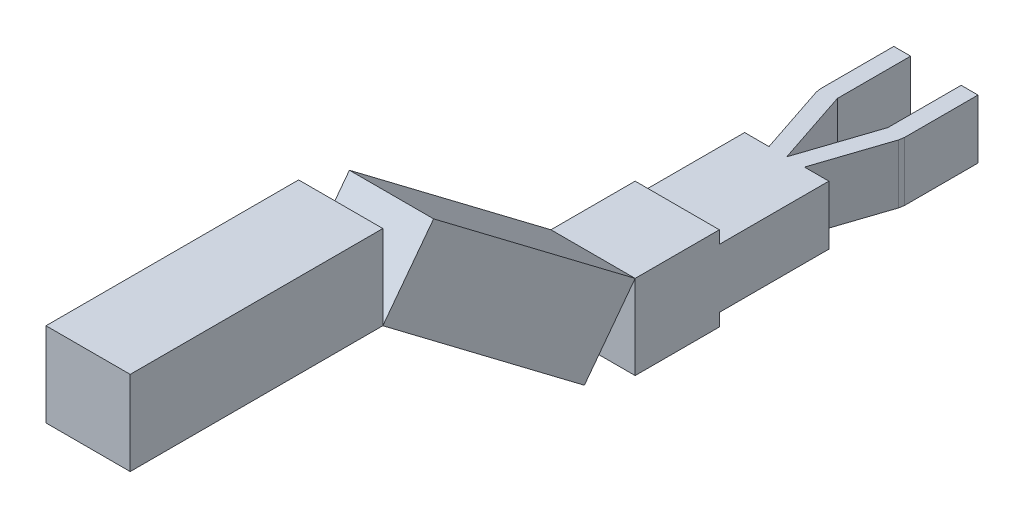
ISO-10303-21;
HEADER;
FILE_DESCRIPTION(('STEP AP214'),'2;1');
FILE_NAME('part.step','',(''),(''),'','','');
FILE_SCHEMA(('AUTOMOTIVE_DESIGN { 1 0 10303 214 1 1 1 1 }'));
ENDSEC;
DATA;
#1=APPLICATION_CONTEXT('core data for automotive mechanical design processes');
#2=APPLICATION_PROTOCOL_DEFINITION('international standard','automotive_design',2000,#1);
#3=PRODUCT_CONTEXT('',#1,'mechanical');
#4=PRODUCT('Part','Part','',(#3));
#5=PRODUCT_RELATED_PRODUCT_CATEGORY('part','',(#4));
#6=PRODUCT_DEFINITION_FORMATION('','',#4);
#7=PRODUCT_DEFINITION_CONTEXT('part definition',#1,'design');
#8=PRODUCT_DEFINITION('design','',#6,#7);
#9=PRODUCT_DEFINITION_SHAPE('','',#8);
#10=(LENGTH_UNIT() NAMED_UNIT(*) SI_UNIT(.MILLI.,.METRE.));
#11=(NAMED_UNIT(*) PLANE_ANGLE_UNIT() SI_UNIT($,.RADIAN.));
#12=(NAMED_UNIT(*) SI_UNIT($,.STERADIAN.) SOLID_ANGLE_UNIT());
#13=UNCERTAINTY_MEASURE_WITH_UNIT(LENGTH_MEASURE(1.E-05),#10,'distance_accuracy_value','');
#14=(GEOMETRIC_REPRESENTATION_CONTEXT(3) GLOBAL_UNCERTAINTY_ASSIGNED_CONTEXT((#13)) GLOBAL_UNIT_ASSIGNED_CONTEXT((#10,
#11,#12)) REPRESENTATION_CONTEXT('',''));
#15=CARTESIAN_POINT('',(0.,0.,0.));
#16=DIRECTION('',(0.,0.,1.));
#17=DIRECTION('',(1.,0.,0.));
#18=AXIS2_PLACEMENT_3D('',#15,#16,#17);
#19=CARTESIAN_POINT('',(50.0000000000001,186.100667301287,635.399647205051));
#20=DIRECTION('',(0.,0.,-1.));
#21=DIRECTION('',(-1.,0.,0.));
#22=AXIS2_PLACEMENT_3D('',#19,#20,#21);
#23=PLANE('',#22);
#24=DIRECTION('',(0.,-1.,0.));
#25=VECTOR('',#24,1.);
#26=CARTESIAN_POINT('',(-50.,186.100667301287,635.399647205051));
#27=LINE('',#26,#25);
#28=CARTESIAN_POINT('',(-50.,286.100667301287,635.399647205051));
#29=VERTEX_POINT('',#28);
#30=CARTESIAN_POINT('',(-50.,186.100667301287,635.399647205051));
#31=VERTEX_POINT('',#30);
#32=EDGE_CURVE('E108',#29,#31,#27,.T.);
#33=ORIENTED_EDGE('',*,*,#32,.F.);
#34=DIRECTION('',(-1.,0.,0.));
#35=VECTOR('',#34,1.);
#36=CARTESIAN_POINT('',(50.0000000000001,286.100667301287,635.399647205051));
#37=LINE('',#36,#35);
#38=CARTESIAN_POINT('',(50.0000000000001,286.100667301287,635.399647205051));
#39=VERTEX_POINT('',#38);
#40=EDGE_CURVE('E12',#39,#29,#37,.T.);
#41=ORIENTED_EDGE('',*,*,#40,.F.);
#42=DIRECTION('',(0.,-1.,0.));
#43=VECTOR('',#42,1.);
#44=CARTESIAN_POINT('',(50.0000000000001,186.100667301287,635.399647205051));
#45=LINE('',#44,#43);
#46=CARTESIAN_POINT('',(50.0000000000001,186.100667301287,635.399647205051));
#47=VERTEX_POINT('',#46);
#48=EDGE_CURVE('E102',#39,#47,#45,.T.);
#49=ORIENTED_EDGE('',*,*,#48,.T.);
#50=DIRECTION('',(-1.,0.,0.));
#51=VECTOR('',#50,1.);
#52=CARTESIAN_POINT('',(50.0000000000001,186.100667301287,635.399647205051));
#53=LINE('',#52,#51);
#54=EDGE_CURVE('E47',#47,#31,#53,.T.);
#55=ORIENTED_EDGE('',*,*,#54,.T.);
#56=EDGE_LOOP('',(#33,#41,#49,#55));
#57=FACE_BOUND('',#56,.T.);
#58=ADVANCED_FACE('F44',(#57),#23,.T.);
#59=CARTESIAN_POINT('',(50.0000000000001,286.100667301287,635.399647205051));
#60=DIRECTION('',(0.,1.,0.));
#61=DIRECTION('',(-1.,0.,0.));
#62=AXIS2_PLACEMENT_3D('',#59,#60,#61);
#63=PLANE('',#62);
#64=DIRECTION('',(0.,0.,-1.));
#65=VECTOR('',#64,1.);
#66=CARTESIAN_POINT('',(-50.,286.100667301287,635.399647205051));
#67=LINE('',#66,#65);
#68=CARTESIAN_POINT('',(-49.9999999999999,286.100667301287,935.399647205051));
#69=VERTEX_POINT('',#68);
#70=EDGE_CURVE('E104',#69,#29,#67,.T.);
#71=ORIENTED_EDGE('',*,*,#70,.F.);
#72=DIRECTION('',(-1.,0.,0.));
#73=VECTOR('',#72,1.);
#74=CARTESIAN_POINT('',(50.0000000000001,286.100667301287,935.399647205051));
#75=LINE('',#74,#73);
#76=CARTESIAN_POINT('',(50.0000000000001,286.100667301287,935.399647205051));
#77=VERTEX_POINT('',#76);
#78=EDGE_CURVE('E53',#77,#69,#75,.T.);
#79=ORIENTED_EDGE('',*,*,#78,.F.);
#80=DIRECTION('',(0.,0.,-1.));
#81=VECTOR('',#80,1.);
#82=CARTESIAN_POINT('',(50.0000000000001,286.100667301287,635.399647205051));
#83=LINE('',#82,#81);
#84=EDGE_CURVE('E99',#77,#39,#83,.T.);
#85=ORIENTED_EDGE('',*,*,#84,.T.);
#86=ORIENTED_EDGE('',*,*,#40,.T.);
#87=EDGE_LOOP('',(#71,#79,#85,#86));
#88=FACE_BOUND('',#87,.T.);
#89=ADVANCED_FACE('F118',(#88),#63,.T.);
#90=CARTESIAN_POINT('',(50.0000000000001,186.100667301287,935.399647205051));
#91=DIRECTION('',(0.,0.,1.));
#92=DIRECTION('',(1.,0.,0.));
#93=AXIS2_PLACEMENT_3D('',#90,#91,#92);
#94=PLANE('',#93);
#95=DIRECTION('',(0.,1.,0.));
#96=VECTOR('',#95,1.);
#97=CARTESIAN_POINT('',(-49.9999999999999,186.100667301287,935.399647205051));
#98=LINE('',#97,#96);
#99=CARTESIAN_POINT('',(-49.9999999999999,186.100667301287,935.399647205051));
#100=VERTEX_POINT('',#99);
#101=EDGE_CURVE('E94',#100,#69,#98,.T.);
#102=ORIENTED_EDGE('',*,*,#101,.F.);
#103=DIRECTION('',(-1.,0.,0.));
#104=VECTOR('',#103,1.);
#105=CARTESIAN_POINT('',(50.0000000000001,186.100667301287,935.399647205051));
#106=LINE('',#105,#104);
#107=CARTESIAN_POINT('',(50.0000000000001,186.100667301287,935.399647205051));
#108=VERTEX_POINT('',#107);
#109=EDGE_CURVE('E89',#108,#100,#106,.T.);
#110=ORIENTED_EDGE('',*,*,#109,.F.);
#111=DIRECTION('',(0.,1.,0.));
#112=VECTOR('',#111,1.);
#113=CARTESIAN_POINT('',(50.0000000000001,186.100667301287,935.399647205051));
#114=LINE('',#113,#112);
#115=EDGE_CURVE('E92',#108,#77,#114,.T.);
#116=ORIENTED_EDGE('',*,*,#115,.T.);
#117=ORIENTED_EDGE('',*,*,#78,.T.);
#118=EDGE_LOOP('',(#102,#110,#116,#117));
#119=FACE_BOUND('',#118,.T.);
#120=ADVANCED_FACE('F91',(#119),#94,.T.);
#121=CARTESIAN_POINT('',(50.0000000000001,186.100667301287,635.399647205051));
#122=DIRECTION('',(0.,-1.,0.));
#123=DIRECTION('',(1.,0.,0.));
#124=AXIS2_PLACEMENT_3D('',#121,#122,#123);
#125=PLANE('',#124);
#126=DIRECTION('',(0.,0.,1.));
#127=VECTOR('',#126,1.);
#128=CARTESIAN_POINT('',(-50.,186.100667301287,635.399647205051));
#129=LINE('',#128,#127);
#130=EDGE_CURVE('E111',#31,#100,#129,.T.);
#131=ORIENTED_EDGE('',*,*,#130,.F.);
#132=ORIENTED_EDGE('',*,*,#54,.F.);
#133=DIRECTION('',(0.,0.,1.));
#134=VECTOR('',#133,1.);
#135=CARTESIAN_POINT('',(50.0000000000001,186.100667301287,635.399647205051));
#136=LINE('',#135,#134);
#137=EDGE_CURVE('E98',#47,#108,#136,.T.);
#138=ORIENTED_EDGE('',*,*,#137,.T.);
#139=ORIENTED_EDGE('',*,*,#109,.T.);
#140=EDGE_LOOP('',(#131,#132,#138,#139));
#141=FACE_BOUND('',#140,.T.);
#142=ADVANCED_FACE('F101',(#141),#125,.T.);
#143=CARTESIAN_POINT('',(50.,0.,0.));
#144=DIRECTION('',(1.,0.,0.));
#145=DIRECTION('',(0.,0.,-1.));
#146=AXIS2_PLACEMENT_3D('',#143,#144,#145);
#147=PLANE('',#146);
#148=ORIENTED_EDGE('',*,*,#48,.F.);
#149=ORIENTED_EDGE('',*,*,#84,.F.);
#150=ORIENTED_EDGE('',*,*,#115,.F.);
#151=ORIENTED_EDGE('',*,*,#137,.F.);
#152=EDGE_LOOP('',(#148,#149,#150,#151));
#153=FACE_BOUND('',#152,.T.);
#154=ADVANCED_FACE('F97',(#153),#147,.T.);
#155=CARTESIAN_POINT('',(-50.,0.,0.));
#156=DIRECTION('',(1.,0.,0.));
#157=DIRECTION('',(0.,0.,-1.));
#158=AXIS2_PLACEMENT_3D('',#155,#156,#157);
#159=PLANE('',#158);
#160=ORIENTED_EDGE('',*,*,#32,.T.);
#161=ORIENTED_EDGE('',*,*,#130,.T.);
#162=ORIENTED_EDGE('',*,*,#101,.T.);
#163=ORIENTED_EDGE('',*,*,#70,.T.);
#164=EDGE_LOOP('',(#160,#161,#162,#163));
#165=FACE_BOUND('',#164,.T.);
#166=ADVANCED_FACE('F117',(#165),#159,.F.);
#167=CLOSED_SHELL('',(#58,#89,#120,#142,#154,#166));
#168=MANIFOLD_SOLID_BREP('B2',#167);
#169=CARTESIAN_POINT('',(50.,85.,335.768782521129));
#170=DIRECTION('',(0.,0.797791926750478,-0.602932866587782));
#171=DIRECTION('',(0.,0.602932866587782,0.797791926750478));
#172=AXIS2_PLACEMENT_3D('',#169,#170,#171);
#173=PLANE('',#172);
#174=DIRECTION('',(0.,-0.602932866587782,-0.797791926750478));
#175=VECTOR('',#174,1.);
#176=CARTESIAN_POINT('',(-50.,85.,335.768782521129));
#177=LINE('',#176,#175);
#178=CARTESIAN_POINT('',(-50.,265.879859976335,575.106360546273));
#179=VERTEX_POINT('',#178);
#180=CARTESIAN_POINT('',(-50.,85.,335.768782521129));
#181=VERTEX_POINT('',#180);
#182=EDGE_CURVE('E241',#179,#181,#177,.T.);
#183=ORIENTED_EDGE('',*,*,#182,.F.);
#184=DIRECTION('',(-1.,0.,0.));
#185=VECTOR('',#184,1.);
#186=CARTESIAN_POINT('',(50.,265.879859976335,575.106360546273));
#187=LINE('',#186,#185);
#188=CARTESIAN_POINT('',(50.,265.879859976335,575.106360546273));
#189=VERTEX_POINT('',#188);
#190=EDGE_CURVE('E42',#189,#179,#187,.T.);
#191=ORIENTED_EDGE('',*,*,#190,.F.);
#192=DIRECTION('',(0.,-0.602932866587782,-0.797791926750478));
#193=VECTOR('',#192,1.);
#194=CARTESIAN_POINT('',(50.,85.,335.768782521129));
#195=LINE('',#194,#193);
#196=CARTESIAN_POINT('',(50.,85.,335.768782521129));
#197=VERTEX_POINT('',#196);
#198=EDGE_CURVE('E235',#189,#197,#195,.T.);
#199=ORIENTED_EDGE('',*,*,#198,.T.);
#200=DIRECTION('',(-1.,0.,0.));
#201=VECTOR('',#200,1.);
#202=CARTESIAN_POINT('',(50.,85.,335.768782521129));
#203=LINE('',#202,#201);
#204=EDGE_CURVE('E180',#197,#181,#203,.T.);
#205=ORIENTED_EDGE('',*,*,#204,.T.);
#206=EDGE_LOOP('',(#183,#191,#199,#205));
#207=FACE_BOUND('',#206,.T.);
#208=ADVANCED_FACE('F177',(#207),#173,.T.);
#209=CARTESIAN_POINT('',(50.,265.879859976335,575.106360546273));
#210=DIRECTION('',(0.,0.602932866587782,0.797791926750478));
#211=DIRECTION('',(0.,-0.797791926750478,0.602932866587782));
#212=AXIS2_PLACEMENT_3D('',#209,#210,#211);
#213=PLANE('',#212);
#214=DIRECTION('',(0.,0.797791926750478,-0.602932866587782));
#215=VECTOR('',#214,1.);
#216=CARTESIAN_POINT('',(-50.,265.879859976335,575.106360546273));
#217=LINE('',#216,#215);
#218=CARTESIAN_POINT('',(-50.,186.100667301287,635.399647205051));
#219=VERTEX_POINT('',#218);
#220=EDGE_CURVE('E237',#219,#179,#217,.T.);
#221=ORIENTED_EDGE('',*,*,#220,.F.);
#222=DIRECTION('',(-1.,0.,0.));
#223=VECTOR('',#222,1.);
#224=CARTESIAN_POINT('',(50.0000000000001,186.100667301287,635.399647205051));
#225=LINE('',#224,#223);
#226=CARTESIAN_POINT('',(50.0000000000001,186.100667301287,635.399647205051));
#227=VERTEX_POINT('',#226);
#228=EDGE_CURVE('E186',#227,#219,#225,.T.);
#229=ORIENTED_EDGE('',*,*,#228,.F.);
#230=DIRECTION('',(0.,0.797791926750478,-0.602932866587782));
#231=VECTOR('',#230,1.);
#232=CARTESIAN_POINT('',(50.,265.879859976335,575.106360546273));
#233=LINE('',#232,#231);
#234=EDGE_CURVE('E232',#227,#189,#233,.T.);
#235=ORIENTED_EDGE('',*,*,#234,.T.);
#236=ORIENTED_EDGE('',*,*,#190,.T.);
#237=EDGE_LOOP('',(#221,#229,#235,#236));
#238=FACE_BOUND('',#237,.T.);
#239=ADVANCED_FACE('F251',(#238),#213,.T.);
#240=CARTESIAN_POINT('',(50.,5.22080732495214,396.062069179907));
#241=DIRECTION('',(0.,-0.797791926750478,0.602932866587782));
#242=DIRECTION('',(0.,-0.602932866587782,-0.797791926750478));
#243=AXIS2_PLACEMENT_3D('',#240,#241,#242);
#244=PLANE('',#243);
#245=DIRECTION('',(0.,0.602932866587782,0.797791926750478));
#246=VECTOR('',#245,1.);
#247=CARTESIAN_POINT('',(-50.,5.22080732495214,396.062069179907));
#248=LINE('',#247,#246);
#249=CARTESIAN_POINT('',(-50.,5.22080732495214,396.062069179907));
#250=VERTEX_POINT('',#249);
#251=EDGE_CURVE('E227',#250,#219,#248,.T.);
#252=ORIENTED_EDGE('',*,*,#251,.F.);
#253=DIRECTION('',(-1.,0.,0.));
#254=VECTOR('',#253,1.);
#255=CARTESIAN_POINT('',(50.,5.22080732495214,396.062069179907));
#256=LINE('',#255,#254);
#257=CARTESIAN_POINT('',(50.,5.22080732495214,396.062069179907));
#258=VERTEX_POINT('',#257);
#259=EDGE_CURVE('E222',#258,#250,#256,.T.);
#260=ORIENTED_EDGE('',*,*,#259,.F.);
#261=DIRECTION('',(0.,0.602932866587782,0.797791926750478));
#262=VECTOR('',#261,1.);
#263=CARTESIAN_POINT('',(50.,5.22080732495214,396.062069179907));
#264=LINE('',#263,#262);
#265=EDGE_CURVE('E225',#258,#227,#264,.T.);
#266=ORIENTED_EDGE('',*,*,#265,.T.);
#267=ORIENTED_EDGE('',*,*,#228,.T.);
#268=EDGE_LOOP('',(#252,#260,#266,#267));
#269=FACE_BOUND('',#268,.T.);
#270=ADVANCED_FACE('F224',(#269),#244,.T.);
#271=CARTESIAN_POINT('',(50.,85.,335.768782521129));
#272=DIRECTION('',(0.,-0.602932866587781,-0.797791926750478));
#273=DIRECTION('',(0.,0.797791926750478,-0.602932866587781));
#274=AXIS2_PLACEMENT_3D('',#271,#272,#273);
#275=PLANE('',#274);
#276=DIRECTION('',(0.,-0.797791926750478,0.602932866587781));
#277=VECTOR('',#276,1.);
#278=CARTESIAN_POINT('',(-50.,85.,335.768782521129));
#279=LINE('',#278,#277);
#280=EDGE_CURVE('E244',#181,#250,#279,.T.);
#281=ORIENTED_EDGE('',*,*,#280,.F.);
#282=ORIENTED_EDGE('',*,*,#204,.F.);
#283=DIRECTION('',(0.,-0.797791926750478,0.602932866587781));
#284=VECTOR('',#283,1.);
#285=CARTESIAN_POINT('',(50.,85.,335.768782521129));
#286=LINE('',#285,#284);
#287=EDGE_CURVE('E231',#197,#258,#286,.T.);
#288=ORIENTED_EDGE('',*,*,#287,.T.);
#289=ORIENTED_EDGE('',*,*,#259,.T.);
#290=EDGE_LOOP('',(#281,#282,#288,#289));
#291=FACE_BOUND('',#290,.T.);
#292=ADVANCED_FACE('F234',(#291),#275,.T.);
#293=CARTESIAN_POINT('',(50.,0.,0.));
#294=DIRECTION('',(1.,0.,0.));
#295=DIRECTION('',(0.,0.,-1.));
#296=AXIS2_PLACEMENT_3D('',#293,#294,#295);
#297=PLANE('',#296);
#298=ORIENTED_EDGE('',*,*,#198,.F.);
#299=ORIENTED_EDGE('',*,*,#234,.F.);
#300=ORIENTED_EDGE('',*,*,#265,.F.);
#301=ORIENTED_EDGE('',*,*,#287,.F.);
#302=EDGE_LOOP('',(#298,#299,#300,#301));
#303=FACE_BOUND('',#302,.T.);
#304=ADVANCED_FACE('F230',(#303),#297,.T.);
#305=CARTESIAN_POINT('',(-50.,0.,0.));
#306=DIRECTION('',(1.,0.,0.));
#307=DIRECTION('',(0.,0.,-1.));
#308=AXIS2_PLACEMENT_3D('',#305,#306,#307);
#309=PLANE('',#308);
#310=ORIENTED_EDGE('',*,*,#182,.T.);
#311=ORIENTED_EDGE('',*,*,#280,.T.);
#312=ORIENTED_EDGE('',*,*,#251,.T.);
#313=ORIENTED_EDGE('',*,*,#220,.T.);
#314=EDGE_LOOP('',(#310,#311,#312,#313));
#315=FACE_BOUND('',#314,.T.);
#316=ADVANCED_FACE('F250',(#315),#309,.F.);
#317=CLOSED_SHELL('',(#208,#239,#270,#292,#304,#316));
#318=MANIFOLD_SOLID_BREP('B6',#317);
#319=CARTESIAN_POINT('',(-50.,70.,-71.3699993654707));
#320=DIRECTION('',(1.,0.,0.));
#321=DIRECTION('',(0.,0.,-1.));
#322=AXIS2_PLACEMENT_3D('',#319,#320,#321);
#323=PLANE('',#322);
#324=DIRECTION('',(0.,0.,1.));
#325=VECTOR('',#324,1.);
#326=CARTESIAN_POINT('',(-50.,0.,-71.3699993654707));
#327=LINE('',#326,#325);
#328=CARTESIAN_POINT('',(-50.,0.,-71.3699993654707));
#329=VERTEX_POINT('',#328);
#330=CARTESIAN_POINT('',(-50.,0.,15.6300006345293));
#331=VERTEX_POINT('',#330);
#332=EDGE_CURVE('E447',#329,#331,#327,.T.);
#333=ORIENTED_EDGE('',*,*,#332,.T.);
#334=DIRECTION('',(0.,-1.,0.));
#335=VECTOR('',#334,1.);
#336=CARTESIAN_POINT('',(-50.,70.,15.6300006345293));
#337=LINE('',#336,#335);
#338=CARTESIAN_POINT('',(-50.,70.,15.6300006345293));
#339=VERTEX_POINT('',#338);
#340=EDGE_CURVE('E175',#339,#331,#337,.T.);
#341=ORIENTED_EDGE('',*,*,#340,.F.);
#342=DIRECTION('',(0.,0.,1.));
#343=VECTOR('',#342,1.);
#344=CARTESIAN_POINT('',(-50.,70.,-71.3699993654707));
#345=LINE('',#344,#343);
#346=CARTESIAN_POINT('',(-50.,70.,-71.3699993654707));
#347=VERTEX_POINT('',#346);
#348=EDGE_CURVE('E497',#347,#339,#345,.T.);
#349=ORIENTED_EDGE('',*,*,#348,.F.);
#350=DIRECTION('',(0.,-1.,0.));
#351=VECTOR('',#350,1.);
#352=CARTESIAN_POINT('',(-50.,70.,-71.3699993654707));
#353=LINE('',#352,#351);
#354=EDGE_CURVE('E443',#347,#329,#353,.T.);
#355=ORIENTED_EDGE('',*,*,#354,.T.);
#356=EDGE_LOOP('',(#333,#341,#349,#355));
#357=FACE_BOUND('',#356,.T.);
#358=ADVANCED_FACE('F301',(#357),#323,.F.);
#359=CARTESIAN_POINT('',(-48.9765856603368,70.,21.9457901082135));
#360=DIRECTION('',(0.98712443061066,0.,-0.159954238742149));
#361=DIRECTION('',(-0.159954238742149,0.,-0.98712443061066));
#362=AXIS2_PLACEMENT_3D('',#359,#360,#361);
#363=PLANE('',#362);
#364=DIRECTION('',(0.159954238742149,0.,0.98712443061066));
#365=VECTOR('',#364,1.);
#366=CARTESIAN_POINT('',(-48.9765856603368,0.,21.9457901082135));
#367=LINE('',#366,#365);
#368=CARTESIAN_POINT('',(-48.9765856603368,0.,21.9457901082135));
#369=VERTEX_POINT('',#368);
#370=EDGE_CURVE('E450',#331,#369,#367,.T.);
#371=ORIENTED_EDGE('',*,*,#370,.T.);
#372=DIRECTION('',(0.,-1.,0.));
#373=VECTOR('',#372,1.);
#374=CARTESIAN_POINT('',(-48.9765856603368,70.,21.9457901082135));
#375=LINE('',#374,#373);
#376=CARTESIAN_POINT('',(-48.9765856603368,70.,21.9457901082135));
#377=VERTEX_POINT('',#376);
#378=EDGE_CURVE('E310',#377,#369,#375,.T.);
#379=ORIENTED_EDGE('',*,*,#378,.F.);
#380=DIRECTION('',(0.159954238742149,0.,0.98712443061066));
#381=VECTOR('',#380,1.);
#382=CARTESIAN_POINT('',(-48.9765856603368,70.,21.9457901082135));
#383=LINE('',#382,#381);
#384=EDGE_CURVE('E384',#339,#377,#383,.T.);
#385=ORIENTED_EDGE('',*,*,#384,.F.);
#386=ORIENTED_EDGE('',*,*,#340,.T.);
#387=EDGE_LOOP('',(#371,#379,#385,#386));
#388=FACE_BOUND('',#387,.T.);
#389=ADVANCED_FACE('F578',(#388),#363,.F.);
#390=CARTESIAN_POINT('',(-21.0786074565587,70.,105.768782521129));
#391=DIRECTION('',(0.948829283016839,0.,-0.315789473684211));
#392=DIRECTION('',(-0.315789473684211,0.,-0.948829283016839));
#393=AXIS2_PLACEMENT_3D('',#390,#391,#392);
#394=PLANE('',#393);
#395=DIRECTION('',(0.31578947368421,0.,0.948829283016839));
#396=VECTOR('',#395,1.);
#397=CARTESIAN_POINT('',(-21.0786074565587,0.,105.768782521129));
#398=LINE('',#397,#396);
#399=CARTESIAN_POINT('',(-21.0786074565587,0.,105.768782521129));
#400=VERTEX_POINT('',#399);
#401=EDGE_CURVE('E453',#369,#400,#398,.T.);
#402=ORIENTED_EDGE('',*,*,#401,.T.);
#403=DIRECTION('',(0.,-1.,0.));
#404=VECTOR('',#403,1.);
#405=CARTESIAN_POINT('',(-21.0786074565587,70.,105.768782521129));
#406=LINE('',#405,#404);
#407=CARTESIAN_POINT('',(-21.0786074565587,70.,105.768782521129));
#408=VERTEX_POINT('',#407);
#409=EDGE_CURVE('E522',#408,#400,#406,.T.);
#410=ORIENTED_EDGE('',*,*,#409,.F.);
#411=DIRECTION('',(0.31578947368421,0.,0.948829283016839));
#412=VECTOR('',#411,1.);
#413=CARTESIAN_POINT('',(-21.0786074565587,70.,105.768782521129));
#414=LINE('',#413,#412);
#415=EDGE_CURVE('E814',#377,#408,#414,.T.);
#416=ORIENTED_EDGE('',*,*,#415,.F.);
#417=ORIENTED_EDGE('',*,*,#378,.T.);
#418=EDGE_LOOP('',(#402,#410,#416,#417));
#419=FACE_BOUND('',#418,.T.);
#420=ADVANCED_FACE('F582',(#419),#394,.F.);
#421=CARTESIAN_POINT('',(-50.,70.,105.768782521129));
#422=DIRECTION('',(0.,0.,1.));
#423=DIRECTION('',(1.,0.,0.));
#424=AXIS2_PLACEMENT_3D('',#421,#422,#423);
#425=PLANE('',#424);
#426=DIRECTION('',(-1.,0.,0.));
#427=VECTOR('',#426,1.);
#428=CARTESIAN_POINT('',(-50.,0.,105.768782521129));
#429=LINE('',#428,#427);
#430=CARTESIAN_POINT('',(-50.,0.,105.768782521129));
#431=VERTEX_POINT('',#430);
#432=EDGE_CURVE('E455',#400,#431,#429,.T.);
#433=ORIENTED_EDGE('',*,*,#432,.T.);
#434=DIRECTION('',(0.,-1.,0.));
#435=VECTOR('',#434,1.);
#436=CARTESIAN_POINT('',(-50.,70.,105.768782521129));
#437=LINE('',#436,#435);
#438=CARTESIAN_POINT('',(-50.,70.,105.768782521129));
#439=VERTEX_POINT('',#438);
#440=EDGE_CURVE('E519',#439,#431,#437,.T.);
#441=ORIENTED_EDGE('',*,*,#440,.F.);
#442=DIRECTION('',(-1.,0.,0.));
#443=VECTOR('',#442,1.);
#444=CARTESIAN_POINT('',(-50.,70.,105.768782521129));
#445=LINE('',#444,#443);
#446=EDGE_CURVE('E537',#408,#439,#445,.T.);
#447=ORIENTED_EDGE('',*,*,#446,.F.);
#448=ORIENTED_EDGE('',*,*,#409,.T.);
#449=EDGE_LOOP('',(#433,#441,#447,#448));
#450=FACE_BOUND('',#449,.T.);
#451=ADVANCED_FACE('F586',(#450),#425,.F.);
#452=CARTESIAN_POINT('',(-50.,70.,105.768782521129));
#453=DIRECTION('',(1.,0.,0.));
#454=DIRECTION('',(0.,0.,-1.));
#455=AXIS2_PLACEMENT_3D('',#452,#453,#454);
#456=PLANE('',#455);
#457=DIRECTION('',(0.,0.,1.));
#458=VECTOR('',#457,1.);
#459=CARTESIAN_POINT('',(-50.,0.,105.768782521129));
#460=LINE('',#459,#458);
#461=CARTESIAN_POINT('',(-50.,0.,235.768782521129));
#462=VERTEX_POINT('',#461);
#463=EDGE_CURVE('E457',#431,#462,#460,.T.);
#464=ORIENTED_EDGE('',*,*,#463,.T.);
#465=DIRECTION('',(0.,-1.,0.));
#466=VECTOR('',#465,1.);
#467=CARTESIAN_POINT('',(-50.,85.,235.768782521129));
#468=LINE('',#467,#466);
#469=CARTESIAN_POINT('',(-50.,-15.,235.768782521129));
#470=VERTEX_POINT('',#469);
#471=EDGE_CURVE('E718',#462,#470,#468,.T.);
#472=ORIENTED_EDGE('',*,*,#471,.T.);
#473=DIRECTION('',(0.,0.,-1.));
#474=VECTOR('',#473,1.);
#475=CARTESIAN_POINT('',(-50.,-15.,335.768782521129));
#476=LINE('',#475,#474);
#477=CARTESIAN_POINT('',(-50.,-15.,335.768782521129));
#478=VERTEX_POINT('',#477);
#479=EDGE_CURVE('E780',#478,#470,#476,.T.);
#480=ORIENTED_EDGE('',*,*,#479,.F.);
#481=DIRECTION('',(0.,-1.,0.));
#482=VECTOR('',#481,1.);
#483=CARTESIAN_POINT('',(-50.,85.,335.768782521129));
#484=LINE('',#483,#482);
#485=CARTESIAN_POINT('',(-50.,85.,335.768782521129));
#486=VERTEX_POINT('',#485);
#487=EDGE_CURVE('E767',#486,#478,#484,.T.);
#488=ORIENTED_EDGE('',*,*,#487,.F.);
#489=DIRECTION('',(0.,0.,-1.));
#490=VECTOR('',#489,1.);
#491=CARTESIAN_POINT('',(-50.,85.,335.768782521129));
#492=LINE('',#491,#490);
#493=CARTESIAN_POINT('',(-50.,85.,235.768782521129));
#494=VERTEX_POINT('',#493);
#495=EDGE_CURVE('E765',#486,#494,#492,.T.);
#496=ORIENTED_EDGE('',*,*,#495,.T.);
#497=CARTESIAN_POINT('',(-50.,70.,235.768782521129));
#498=VERTEX_POINT('',#497);
#499=EDGE_CURVE('E729',#494,#498,#468,.T.);
#500=ORIENTED_EDGE('',*,*,#499,.T.);
#501=DIRECTION('',(0.,0.,1.));
#502=VECTOR('',#501,1.);
#503=CARTESIAN_POINT('',(-50.,70.,105.768782521129));
#504=LINE('',#503,#502);
#505=EDGE_CURVE('E532',#439,#498,#504,.T.);
#506=ORIENTED_EDGE('',*,*,#505,.F.);
#507=ORIENTED_EDGE('',*,*,#440,.T.);
#508=EDGE_LOOP('',(#464,#472,#480,#488,#496,#500,#506,#507));
#509=FACE_BOUND('',#508,.T.);
#510=ADVANCED_FACE('F592',(#509),#456,.F.);
#511=CARTESIAN_POINT('',(50.,70.,105.768782521129));
#512=DIRECTION('',(-1.,0.,0.));
#513=DIRECTION('',(0.,0.,1.));
#514=AXIS2_PLACEMENT_3D('',#511,#512,#513);
#515=PLANE('',#514);
#516=DIRECTION('',(0.,0.,-1.));
#517=VECTOR('',#516,1.);
#518=CARTESIAN_POINT('',(50.,0.,105.768782521129));
#519=LINE('',#518,#517);
#520=CARTESIAN_POINT('',(50.,0.,235.768782521129));
#521=VERTEX_POINT('',#520);
#522=CARTESIAN_POINT('',(50.,0.,105.768782521129));
#523=VERTEX_POINT('',#522);
#524=EDGE_CURVE('E466',#521,#523,#519,.T.);
#525=ORIENTED_EDGE('',*,*,#524,.T.);
#526=DIRECTION('',(0.,-1.,0.));
#527=VECTOR('',#526,1.);
#528=CARTESIAN_POINT('',(50.,70.,105.768782521129));
#529=LINE('',#528,#527);
#530=CARTESIAN_POINT('',(50.,70.,105.768782521129));
#531=VERTEX_POINT('',#530);
#532=EDGE_CURVE('E517',#531,#523,#529,.T.);
#533=ORIENTED_EDGE('',*,*,#532,.F.);
#534=DIRECTION('',(0.,0.,-1.));
#535=VECTOR('',#534,1.);
#536=CARTESIAN_POINT('',(50.,70.,105.768782521129));
#537=LINE('',#536,#535);
#538=CARTESIAN_POINT('',(50.,70.,235.768782521129));
#539=VERTEX_POINT('',#538);
#540=EDGE_CURVE('E531',#539,#531,#537,.T.);
#541=ORIENTED_EDGE('',*,*,#540,.F.);
#542=DIRECTION('',(0.,1.,0.));
#543=VECTOR('',#542,1.);
#544=CARTESIAN_POINT('',(50.,85.,235.768782521129));
#545=LINE('',#544,#543);
#546=CARTESIAN_POINT('',(50.,85.,235.768782521129));
#547=VERTEX_POINT('',#546);
#548=EDGE_CURVE('E777',#539,#547,#545,.T.);
#549=ORIENTED_EDGE('',*,*,#548,.T.);
#550=DIRECTION('',(0.,0.,-1.));
#551=VECTOR('',#550,1.);
#552=CARTESIAN_POINT('',(50.,85.,335.768782521129));
#553=LINE('',#552,#551);
#554=CARTESIAN_POINT('',(50.,85.,335.768782521129));
#555=VERTEX_POINT('',#554);
#556=EDGE_CURVE('E451',#555,#547,#553,.T.);
#557=ORIENTED_EDGE('',*,*,#556,.F.);
#558=DIRECTION('',(0.,1.,0.));
#559=VECTOR('',#558,1.);
#560=CARTESIAN_POINT('',(50.,85.,335.768782521129));
#561=LINE('',#560,#559);
#562=CARTESIAN_POINT('',(50.,-15.,335.768782521129));
#563=VERTEX_POINT('',#562);
#564=EDGE_CURVE('E768',#563,#555,#561,.T.);
#565=ORIENTED_EDGE('',*,*,#564,.F.);
#566=DIRECTION('',(0.,0.,-1.));
#567=VECTOR('',#566,1.);
#568=CARTESIAN_POINT('',(50.,-15.,335.768782521129));
#569=LINE('',#568,#567);
#570=CARTESIAN_POINT('',(50.,-15.,235.768782521129));
#571=VERTEX_POINT('',#570);
#572=EDGE_CURVE('E802',#563,#571,#569,.T.);
#573=ORIENTED_EDGE('',*,*,#572,.T.);
#574=EDGE_CURVE('E784',#571,#521,#545,.T.);
#575=ORIENTED_EDGE('',*,*,#574,.T.);
#576=EDGE_LOOP('',(#525,#533,#541,#549,#557,#565,#573,#575));
#577=FACE_BOUND('',#576,.T.);
#578=ADVANCED_FACE('F596',(#577),#515,.F.);
#579=CARTESIAN_POINT('',(21.0786074565587,70.,105.768782521129));
#580=DIRECTION('',(0.,0.,1.));
#581=DIRECTION('',(1.,0.,0.));
#582=AXIS2_PLACEMENT_3D('',#579,#580,#581);
#583=PLANE('',#582);
#584=DIRECTION('',(-1.,0.,0.));
#585=VECTOR('',#584,1.);
#586=CARTESIAN_POINT('',(21.0786074565587,0.,105.768782521129));
#587=LINE('',#586,#585);
#588=CARTESIAN_POINT('',(21.0786074565587,0.,105.768782521129));
#589=VERTEX_POINT('',#588);
#590=EDGE_CURVE('E460',#523,#589,#587,.T.);
#591=ORIENTED_EDGE('',*,*,#590,.T.);
#592=DIRECTION('',(0.,-1.,0.));
#593=VECTOR('',#592,1.);
#594=CARTESIAN_POINT('',(21.0786074565587,70.,105.768782521129));
#595=LINE('',#594,#593);
#596=CARTESIAN_POINT('',(21.0786074565587,70.,105.768782521129));
#597=VERTEX_POINT('',#596);
#598=EDGE_CURVE('E515',#597,#589,#595,.T.);
#599=ORIENTED_EDGE('',*,*,#598,.F.);
#600=DIRECTION('',(-1.,0.,0.));
#601=VECTOR('',#600,1.);
#602=CARTESIAN_POINT('',(21.0786074565587,70.,105.768782521129));
#603=LINE('',#602,#601);
#604=EDGE_CURVE('E539',#531,#597,#603,.T.);
#605=ORIENTED_EDGE('',*,*,#604,.F.);
#606=ORIENTED_EDGE('',*,*,#532,.T.);
#607=EDGE_LOOP('',(#591,#599,#605,#606));
#608=FACE_BOUND('',#607,.T.);
#609=ADVANCED_FACE('F600',(#608),#583,.F.);
#610=CARTESIAN_POINT('',(21.0786074565587,70.,105.768782521129));
#611=DIRECTION('',(-0.948829283016839,0.,-0.31578947368421));
#612=DIRECTION('',(-0.31578947368421,0.,0.948829283016839));
#613=AXIS2_PLACEMENT_3D('',#610,#611,#612);
#614=PLANE('',#613);
#615=DIRECTION('',(0.31578947368421,0.,-0.948829283016839));
#616=VECTOR('',#615,1.);
#617=CARTESIAN_POINT('',(21.0786074565587,0.,105.768782521129));
#618=LINE('',#617,#616);
#619=CARTESIAN_POINT('',(48.9765856603368,0.,21.9457901082136));
#620=VERTEX_POINT('',#619);
#621=EDGE_CURVE('E474',#589,#620,#618,.T.);
#622=ORIENTED_EDGE('',*,*,#621,.T.);
#623=DIRECTION('',(0.,-1.,0.));
#624=VECTOR('',#623,1.);
#625=CARTESIAN_POINT('',(48.9765856603368,70.,21.9457901082136));
#626=LINE('',#625,#624);
#627=CARTESIAN_POINT('',(48.9765856603368,70.,21.9457901082136));
#628=VERTEX_POINT('',#627);
#629=EDGE_CURVE('E513',#628,#620,#626,.T.);
#630=ORIENTED_EDGE('',*,*,#629,.F.);
#631=DIRECTION('',(0.31578947368421,0.,-0.948829283016839));
#632=VECTOR('',#631,1.);
#633=CARTESIAN_POINT('',(21.0786074565587,70.,105.768782521129));
#634=LINE('',#633,#632);
#635=EDGE_CURVE('E541',#597,#628,#634,.T.);
#636=ORIENTED_EDGE('',*,*,#635,.F.);
#637=ORIENTED_EDGE('',*,*,#598,.T.);
#638=EDGE_LOOP('',(#622,#630,#636,#637));
#639=FACE_BOUND('',#638,.T.);
#640=ADVANCED_FACE('F603',(#639),#614,.F.);
#641=CARTESIAN_POINT('',(50.,70.,15.6300006345293));
#642=DIRECTION('',(-0.98712443061066,0.,-0.159954238742149));
#643=DIRECTION('',(-0.159954238742149,0.,0.98712443061066));
#644=AXIS2_PLACEMENT_3D('',#641,#642,#643);
#645=PLANE('',#644);
#646=DIRECTION('',(0.159954238742149,0.,-0.98712443061066));
#647=VECTOR('',#646,1.);
#648=CARTESIAN_POINT('',(50.,0.,15.6300006345293));
#649=LINE('',#648,#647);
#650=CARTESIAN_POINT('',(50.,0.,15.6300006345293));
#651=VERTEX_POINT('',#650);
#652=EDGE_CURVE('E479',#620,#651,#649,.T.);
#653=ORIENTED_EDGE('',*,*,#652,.T.);
#654=DIRECTION('',(0.,-1.,0.));
#655=VECTOR('',#654,1.);
#656=CARTESIAN_POINT('',(50.,70.,15.6300006345293));
#657=LINE('',#656,#655);
#658=CARTESIAN_POINT('',(50.,70.,15.6300006345293));
#659=VERTEX_POINT('',#658);
#660=EDGE_CURVE('E510',#659,#651,#657,.T.);
#661=ORIENTED_EDGE('',*,*,#660,.F.);
#662=DIRECTION('',(0.159954238742149,0.,-0.98712443061066));
#663=VECTOR('',#662,1.);
#664=CARTESIAN_POINT('',(50.,70.,15.6300006345293));
#665=LINE('',#664,#663);
#666=EDGE_CURVE('E543',#628,#659,#665,.T.);
#667=ORIENTED_EDGE('',*,*,#666,.F.);
#668=ORIENTED_EDGE('',*,*,#629,.T.);
#669=EDGE_LOOP('',(#653,#661,#667,#668));
#670=FACE_BOUND('',#669,.T.);
#671=ADVANCED_FACE('F606',(#670),#645,.F.);
#672=CARTESIAN_POINT('',(50.,70.,-71.3699993654707));
#673=DIRECTION('',(-1.,0.,0.));
#674=DIRECTION('',(0.,0.,1.));
#675=AXIS2_PLACEMENT_3D('',#672,#673,#674);
#676=PLANE('',#675);
#677=DIRECTION('',(0.,0.,-1.));
#678=VECTOR('',#677,1.);
#679=CARTESIAN_POINT('',(50.,0.,-71.3699993654707));
#680=LINE('',#679,#678);
#681=CARTESIAN_POINT('',(50.,0.,-71.3699993654707));
#682=VERTEX_POINT('',#681);
#683=EDGE_CURVE('E484',#651,#682,#680,.T.);
#684=ORIENTED_EDGE('',*,*,#683,.T.);
#685=DIRECTION('',(0.,-1.,0.));
#686=VECTOR('',#685,1.);
#687=CARTESIAN_POINT('',(50.,70.,-71.3699993654707));
#688=LINE('',#687,#686);
#689=CARTESIAN_POINT('',(50.,70.,-71.3699993654707));
#690=VERTEX_POINT('',#689);
#691=EDGE_CURVE('E507',#690,#682,#688,.T.);
#692=ORIENTED_EDGE('',*,*,#691,.F.);
#693=DIRECTION('',(0.,0.,-1.));
#694=VECTOR('',#693,1.);
#695=CARTESIAN_POINT('',(50.,70.,-71.3699993654707));
#696=LINE('',#695,#694);
#697=EDGE_CURVE('E545',#659,#690,#696,.T.);
#698=ORIENTED_EDGE('',*,*,#697,.F.);
#699=ORIENTED_EDGE('',*,*,#660,.T.);
#700=EDGE_LOOP('',(#684,#692,#698,#699));
#701=FACE_BOUND('',#700,.T.);
#702=ADVANCED_FACE('F609',(#701),#676,.F.);
#703=CARTESIAN_POINT('',(30.,70.,-71.3699993654707));
#704=DIRECTION('',(0.,0.,1.));
#705=DIRECTION('',(1.,0.,0.));
#706=AXIS2_PLACEMENT_3D('',#703,#704,#705);
#707=PLANE('',#706);
#708=DIRECTION('',(-1.,0.,0.));
#709=VECTOR('',#708,1.);
#710=CARTESIAN_POINT('',(30.,0.,-71.3699993654707));
#711=LINE('',#710,#709);
#712=CARTESIAN_POINT('',(30.,0.,-71.3699993654707));
#713=VERTEX_POINT('',#712);
#714=EDGE_CURVE('E488',#682,#713,#711,.T.);
#715=ORIENTED_EDGE('',*,*,#714,.T.);
#716=DIRECTION('',(0.,-1.,0.));
#717=VECTOR('',#716,1.);
#718=CARTESIAN_POINT('',(30.,70.,-71.3699993654707));
#719=LINE('',#718,#717);
#720=CARTESIAN_POINT('',(30.,70.,-71.3699993654707));
#721=VERTEX_POINT('',#720);
#722=EDGE_CURVE('E504',#721,#713,#719,.T.);
#723=ORIENTED_EDGE('',*,*,#722,.F.);
#724=DIRECTION('',(-1.,0.,0.));
#725=VECTOR('',#724,1.);
#726=CARTESIAN_POINT('',(30.,70.,-71.3699993654707));
#727=LINE('',#726,#725);
#728=EDGE_CURVE('E547',#690,#721,#727,.T.);
#729=ORIENTED_EDGE('',*,*,#728,.F.);
#730=ORIENTED_EDGE('',*,*,#691,.T.);
#731=EDGE_LOOP('',(#715,#723,#729,#730));
#732=FACE_BOUND('',#731,.T.);
#733=ADVANCED_FACE('F613',(#732),#707,.F.);
#734=CARTESIAN_POINT('',(30.,70.,-71.3699993654707));
#735=DIRECTION('',(1.,0.,0.));
#736=DIRECTION('',(0.,0.,-1.));
#737=AXIS2_PLACEMENT_3D('',#734,#735,#736);
#738=PLANE('',#737);
#739=DIRECTION('',(0.,0.,1.));
#740=VECTOR('',#739,1.);
#741=CARTESIAN_POINT('',(30.,0.,-71.3699993654707));
#742=LINE('',#741,#740);
#743=CARTESIAN_POINT('',(30.,0.,15.6300006345293));
#744=VERTEX_POINT('',#743);
#745=EDGE_CURVE('E490',#713,#744,#742,.T.);
#746=ORIENTED_EDGE('',*,*,#745,.T.);
#747=DIRECTION('',(0.,-1.,0.));
#748=VECTOR('',#747,1.);
#749=CARTESIAN_POINT('',(30.,70.,15.6300006345293));
#750=LINE('',#749,#748);
#751=CARTESIAN_POINT('',(30.,70.,15.6300006345293));
#752=VERTEX_POINT('',#751);
#753=EDGE_CURVE('E501',#752,#744,#750,.T.);
#754=ORIENTED_EDGE('',*,*,#753,.F.);
#755=DIRECTION('',(0.,0.,1.));
#756=VECTOR('',#755,1.);
#757=CARTESIAN_POINT('',(30.,70.,-71.3699993654707));
#758=LINE('',#757,#756);
#759=EDGE_CURVE('E549',#721,#752,#758,.T.);
#760=ORIENTED_EDGE('',*,*,#759,.F.);
#761=ORIENTED_EDGE('',*,*,#722,.T.);
#762=EDGE_LOOP('',(#746,#754,#760,#761));
#763=FACE_BOUND('',#762,.T.);
#764=ADVANCED_FACE('F555',(#763),#738,.F.);
#765=CARTESIAN_POINT('',(0.,70.,105.768782521129));
#766=DIRECTION('',(0.948829283016839,0.,0.31578947368421));
#767=DIRECTION('',(0.315789473684211,0.,-0.948829283016839));
#768=AXIS2_PLACEMENT_3D('',#765,#766,#767);
#769=PLANE('',#768);
#770=DIRECTION('',(-0.315789473684211,0.,0.948829283016839));
#771=VECTOR('',#770,1.);
#772=CARTESIAN_POINT('',(0.,0.,105.768782521129));
#773=LINE('',#772,#771);
#774=CARTESIAN_POINT('',(0.,0.,105.768782521129));
#775=VERTEX_POINT('',#774);
#776=EDGE_CURVE('E492',#744,#775,#773,.T.);
#777=ORIENTED_EDGE('',*,*,#776,.T.);
#778=DIRECTION('',(0.,-1.,0.));
#779=VECTOR('',#778,1.);
#780=CARTESIAN_POINT('',(0.,70.,105.768782521129));
#781=LINE('',#780,#779);
#782=CARTESIAN_POINT('',(0.,70.,105.768782521129));
#783=VERTEX_POINT('',#782);
#784=EDGE_CURVE('E438',#783,#775,#781,.T.);
#785=ORIENTED_EDGE('',*,*,#784,.F.);
#786=DIRECTION('',(-0.315789473684211,0.,0.948829283016839));
#787=VECTOR('',#786,1.);
#788=CARTESIAN_POINT('',(0.,70.,105.768782521129));
#789=LINE('',#788,#787);
#790=EDGE_CURVE('E429',#752,#783,#789,.T.);
#791=ORIENTED_EDGE('',*,*,#790,.F.);
#792=ORIENTED_EDGE('',*,*,#753,.T.);
#793=EDGE_LOOP('',(#777,#785,#791,#792));
#794=FACE_BOUND('',#793,.T.);
#795=ADVANCED_FACE('F559',(#794),#769,.F.);
#796=CARTESIAN_POINT('',(0.,70.,105.768782521129));
#797=DIRECTION('',(-0.948829283016839,0.,0.31578947368421));
#798=DIRECTION('',(0.315789473684211,0.,0.948829283016839));
#799=AXIS2_PLACEMENT_3D('',#796,#797,#798);
#800=PLANE('',#799);
#801=DIRECTION('',(-0.315789473684211,0.,-0.948829283016839));
#802=VECTOR('',#801,1.);
#803=CARTESIAN_POINT('',(0.,0.,105.768782521129));
#804=LINE('',#803,#802);
#805=CARTESIAN_POINT('',(-30.,0.,15.6300006345293));
#806=VERTEX_POINT('',#805);
#807=EDGE_CURVE('E437',#775,#806,#804,.T.);
#808=ORIENTED_EDGE('',*,*,#807,.T.);
#809=DIRECTION('',(0.,-1.,0.));
#810=VECTOR('',#809,1.);
#811=CARTESIAN_POINT('',(-30.,70.,15.6300006345293));
#812=LINE('',#811,#810);
#813=CARTESIAN_POINT('',(-30.,70.,15.6300006345293));
#814=VERTEX_POINT('',#813);
#815=EDGE_CURVE('E434',#814,#806,#812,.T.);
#816=ORIENTED_EDGE('',*,*,#815,.F.);
#817=DIRECTION('',(-0.315789473684211,0.,-0.948829283016839));
#818=VECTOR('',#817,1.);
#819=CARTESIAN_POINT('',(0.,70.,105.768782521129));
#820=LINE('',#819,#818);
#821=EDGE_CURVE('E423',#783,#814,#820,.T.);
#822=ORIENTED_EDGE('',*,*,#821,.F.);
#823=ORIENTED_EDGE('',*,*,#784,.T.);
#824=EDGE_LOOP('',(#808,#816,#822,#823));
#825=FACE_BOUND('',#824,.T.);
#826=ADVANCED_FACE('F435',(#825),#800,.F.);
#827=CARTESIAN_POINT('',(-30.,70.,-71.3699993654707));
#828=DIRECTION('',(-1.,0.,0.));
#829=DIRECTION('',(0.,0.,1.));
#830=AXIS2_PLACEMENT_3D('',#827,#828,#829);
#831=PLANE('',#830);
#832=DIRECTION('',(0.,0.,-1.));
#833=VECTOR('',#832,1.);
#834=CARTESIAN_POINT('',(-30.,0.,-71.3699993654707));
#835=LINE('',#834,#833);
#836=CARTESIAN_POINT('',(-30.,0.,-71.3699993654707));
#837=VERTEX_POINT('',#836);
#838=EDGE_CURVE('E370',#806,#837,#835,.T.);
#839=ORIENTED_EDGE('',*,*,#838,.T.);
#840=DIRECTION('',(0.,-1.,0.));
#841=VECTOR('',#840,1.);
#842=CARTESIAN_POINT('',(-30.,70.,-71.3699993654707));
#843=LINE('',#842,#841);
#844=CARTESIAN_POINT('',(-30.,70.,-71.3699993654707));
#845=VERTEX_POINT('',#844);
#846=EDGE_CURVE('E439',#845,#837,#843,.T.);
#847=ORIENTED_EDGE('',*,*,#846,.F.);
#848=DIRECTION('',(0.,0.,-1.));
#849=VECTOR('',#848,1.);
#850=CARTESIAN_POINT('',(-30.,70.,-71.3699993654707));
#851=LINE('',#850,#849);
#852=EDGE_CURVE('E427',#814,#845,#851,.T.);
#853=ORIENTED_EDGE('',*,*,#852,.F.);
#854=ORIENTED_EDGE('',*,*,#815,.T.);
#855=EDGE_LOOP('',(#839,#847,#853,#854));
#856=FACE_BOUND('',#855,.T.);
#857=ADVANCED_FACE('F441',(#856),#831,.F.);
#858=CARTESIAN_POINT('',(-50.,70.,-71.3699993654707));
#859=DIRECTION('',(0.,0.,1.));
#860=DIRECTION('',(1.,0.,0.));
#861=AXIS2_PLACEMENT_3D('',#858,#859,#860);
#862=PLANE('',#861);
#863=DIRECTION('',(-1.,0.,0.));
#864=VECTOR('',#863,1.);
#865=CARTESIAN_POINT('',(-50.,0.,-71.3699993654707));
#866=LINE('',#865,#864);
#867=EDGE_CURVE('E376',#837,#329,#866,.T.);
#868=ORIENTED_EDGE('',*,*,#867,.T.);
#869=ORIENTED_EDGE('',*,*,#354,.F.);
#870=DIRECTION('',(-1.,0.,0.));
#871=VECTOR('',#870,1.);
#872=CARTESIAN_POINT('',(-50.,70.,-71.3699993654707));
#873=LINE('',#872,#871);
#874=EDGE_CURVE('E319',#845,#347,#873,.T.);
#875=ORIENTED_EDGE('',*,*,#874,.F.);
#876=ORIENTED_EDGE('',*,*,#846,.T.);
#877=EDGE_LOOP('',(#868,#869,#875,#876));
#878=FACE_BOUND('',#877,.T.);
#879=ADVANCED_FACE('F567',(#878),#862,.F.);
#880=CARTESIAN_POINT('',(0.,70.,0.));
#881=DIRECTION('',(0.,1.,0.));
#882=DIRECTION('',(0.,0.,1.));
#883=AXIS2_PLACEMENT_3D('',#880,#881,#882);
#884=PLANE('',#883);
#885=ORIENTED_EDGE('',*,*,#348,.T.);
#886=ORIENTED_EDGE('',*,*,#384,.T.);
#887=ORIENTED_EDGE('',*,*,#415,.T.);
#888=ORIENTED_EDGE('',*,*,#446,.T.);
#889=ORIENTED_EDGE('',*,*,#505,.T.);
#890=DIRECTION('',(1.,0.,0.));
#891=VECTOR('',#890,1.);
#892=CARTESIAN_POINT('',(-50.,70.,235.768782521129));
#893=LINE('',#892,#891);
#894=EDGE_CURVE('E527',#498,#539,#893,.T.);
#895=ORIENTED_EDGE('',*,*,#894,.T.);
#896=ORIENTED_EDGE('',*,*,#540,.T.);
#897=ORIENTED_EDGE('',*,*,#604,.T.);
#898=ORIENTED_EDGE('',*,*,#635,.T.);
#899=ORIENTED_EDGE('',*,*,#666,.T.);
#900=ORIENTED_EDGE('',*,*,#697,.T.);
#901=ORIENTED_EDGE('',*,*,#728,.T.);
#902=ORIENTED_EDGE('',*,*,#759,.T.);
#903=ORIENTED_EDGE('',*,*,#790,.T.);
#904=ORIENTED_EDGE('',*,*,#821,.T.);
#905=ORIENTED_EDGE('',*,*,#852,.T.);
#906=ORIENTED_EDGE('',*,*,#874,.T.);
#907=EDGE_LOOP('',(#885,#886,#887,#888,#889,#895,#896,#897,#898,#899,#900,#901,#902,#903,#904,
#905,#906));
#908=FACE_BOUND('',#907,.T.);
#909=ADVANCED_FACE('F425',(#908),#884,.T.);
#910=CARTESIAN_POINT('',(0.,0.,0.));
#911=DIRECTION('',(0.,1.,0.));
#912=DIRECTION('',(0.,0.,1.));
#913=AXIS2_PLACEMENT_3D('',#910,#911,#912);
#914=PLANE('',#913);
#915=ORIENTED_EDGE('',*,*,#332,.F.);
#916=ORIENTED_EDGE('',*,*,#867,.F.);
#917=ORIENTED_EDGE('',*,*,#838,.F.);
#918=ORIENTED_EDGE('',*,*,#807,.F.);
#919=ORIENTED_EDGE('',*,*,#776,.F.);
#920=ORIENTED_EDGE('',*,*,#745,.F.);
#921=ORIENTED_EDGE('',*,*,#714,.F.);
#922=ORIENTED_EDGE('',*,*,#683,.F.);
#923=ORIENTED_EDGE('',*,*,#652,.F.);
#924=ORIENTED_EDGE('',*,*,#621,.F.);
#925=ORIENTED_EDGE('',*,*,#590,.F.);
#926=ORIENTED_EDGE('',*,*,#524,.F.);
#927=DIRECTION('',(1.,0.,0.));
#928=VECTOR('',#927,1.);
#929=CARTESIAN_POINT('',(-50.,0.,235.768782521129));
#930=LINE('',#929,#928);
#931=EDGE_CURVE('E463',#462,#521,#930,.T.);
#932=ORIENTED_EDGE('',*,*,#931,.F.);
#933=ORIENTED_EDGE('',*,*,#463,.F.);
#934=ORIENTED_EDGE('',*,*,#432,.F.);
#935=ORIENTED_EDGE('',*,*,#401,.F.);
#936=ORIENTED_EDGE('',*,*,#370,.F.);
#937=EDGE_LOOP('',(#915,#916,#917,#918,#919,#920,#921,#922,#923,#924,#925,#926,#932,#933,#934,
#935,#936));
#938=FACE_BOUND('',#937,.T.);
#939=ADVANCED_FACE('F562',(#938),#914,.F.);
#940=CARTESIAN_POINT('',(0.,0.,235.768782521129));
#941=DIRECTION('',(0.,0.,-1.));
#942=DIRECTION('',(-1.,0.,0.));
#943=AXIS2_PLACEMENT_3D('',#940,#941,#942);
#944=PLANE('',#943);
#945=ORIENTED_EDGE('',*,*,#894,.F.);
#946=ORIENTED_EDGE('',*,*,#499,.F.);
#947=DIRECTION('',(-1.,0.,0.));
#948=VECTOR('',#947,1.);
#949=CARTESIAN_POINT('',(50.,85.,235.768782521129));
#950=LINE('',#949,#948);
#951=EDGE_CURVE('E730',#547,#494,#950,.T.);
#952=ORIENTED_EDGE('',*,*,#951,.F.);
#953=ORIENTED_EDGE('',*,*,#548,.F.);
#954=EDGE_LOOP('',(#945,#946,#952,#953));
#955=FACE_BOUND('',#954,.T.);
#956=ADVANCED_FACE('F665',(#955),#944,.T.);
#957=CARTESIAN_POINT('',(50.,85.,335.768782521129));
#958=DIRECTION('',(0.,-1.,0.));
#959=DIRECTION('',(1.,0.,0.));
#960=AXIS2_PLACEMENT_3D('',#957,#958,#959);
#961=PLANE('',#960);
#962=ORIENTED_EDGE('',*,*,#951,.T.);
#963=ORIENTED_EDGE('',*,*,#495,.F.);
#964=DIRECTION('',(-1.,0.,0.));
#965=VECTOR('',#964,1.);
#966=CARTESIAN_POINT('',(50.,85.,335.768782521129));
#967=LINE('',#966,#965);
#968=EDGE_CURVE('E761',#555,#486,#967,.T.);
#969=ORIENTED_EDGE('',*,*,#968,.F.);
#970=ORIENTED_EDGE('',*,*,#556,.T.);
#971=EDGE_LOOP('',(#962,#963,#969,#970));
#972=FACE_BOUND('',#971,.T.);
#973=ADVANCED_FACE('F672',(#972),#961,.F.);
#974=CARTESIAN_POINT('',(50.,-15.,335.768782521129));
#975=DIRECTION('',(0.,1.,0.));
#976=DIRECTION('',(-1.,0.,0.));
#977=AXIS2_PLACEMENT_3D('',#974,#975,#976);
#978=PLANE('',#977);
#979=DIRECTION('',(1.,0.,0.));
#980=VECTOR('',#979,1.);
#981=CARTESIAN_POINT('',(50.,-15.,235.768782521129));
#982=LINE('',#981,#980);
#983=EDGE_CURVE('E725',#470,#571,#982,.T.);
#984=ORIENTED_EDGE('',*,*,#983,.T.);
#985=ORIENTED_EDGE('',*,*,#572,.F.);
#986=DIRECTION('',(1.,0.,0.));
#987=VECTOR('',#986,1.);
#988=CARTESIAN_POINT('',(50.,-15.,335.768782521129));
#989=LINE('',#988,#987);
#990=EDGE_CURVE('E772',#478,#563,#989,.T.);
#991=ORIENTED_EDGE('',*,*,#990,.F.);
#992=ORIENTED_EDGE('',*,*,#479,.T.);
#993=EDGE_LOOP('',(#984,#985,#991,#992));
#994=FACE_BOUND('',#993,.T.);
#995=ADVANCED_FACE('F683',(#994),#978,.F.);
#996=CARTESIAN_POINT('',(0.,0.,335.768782521129));
#997=DIRECTION('',(0.,0.,-1.));
#998=DIRECTION('',(-1.,0.,0.));
#999=AXIS2_PLACEMENT_3D('',#996,#997,#998);
#1000=PLANE('',#999);
#1001=ORIENTED_EDGE('',*,*,#564,.T.);
#1002=ORIENTED_EDGE('',*,*,#968,.T.);
#1003=ORIENTED_EDGE('',*,*,#487,.T.);
#1004=ORIENTED_EDGE('',*,*,#990,.T.);
#1005=EDGE_LOOP('',(#1001,#1002,#1003,#1004));
#1006=FACE_BOUND('',#1005,.T.);
#1007=ADVANCED_FACE('F693',(#1006),#1000,.F.);
#1008=ORIENTED_EDGE('',*,*,#471,.F.);
#1009=ORIENTED_EDGE('',*,*,#931,.T.);
#1010=ORIENTED_EDGE('',*,*,#574,.F.);
#1011=ORIENTED_EDGE('',*,*,#983,.F.);
#1012=EDGE_LOOP('',(#1008,#1009,#1010,#1011));
#1013=FACE_BOUND('',#1012,.T.);
#1014=ADVANCED_FACE('F675',(#1013),#944,.T.);
#1015=CLOSED_SHELL('',(#358,#389,#420,#451,#510,#578,#609,#640,#671,#702,#733,#764,#795,#826,
#857,#879,#909,#939,#956,#973,#995,#1007,#1014));
#1016=MANIFOLD_SOLID_BREP('B36',#1015);
#1017=ADVANCED_BREP_SHAPE_REPRESENTATION('',(#18,#168,#318,#1016),#14);
#1018=SHAPE_DEFINITION_REPRESENTATION(#9,#1017);
ENDSEC;
END-ISO-10303-21;
